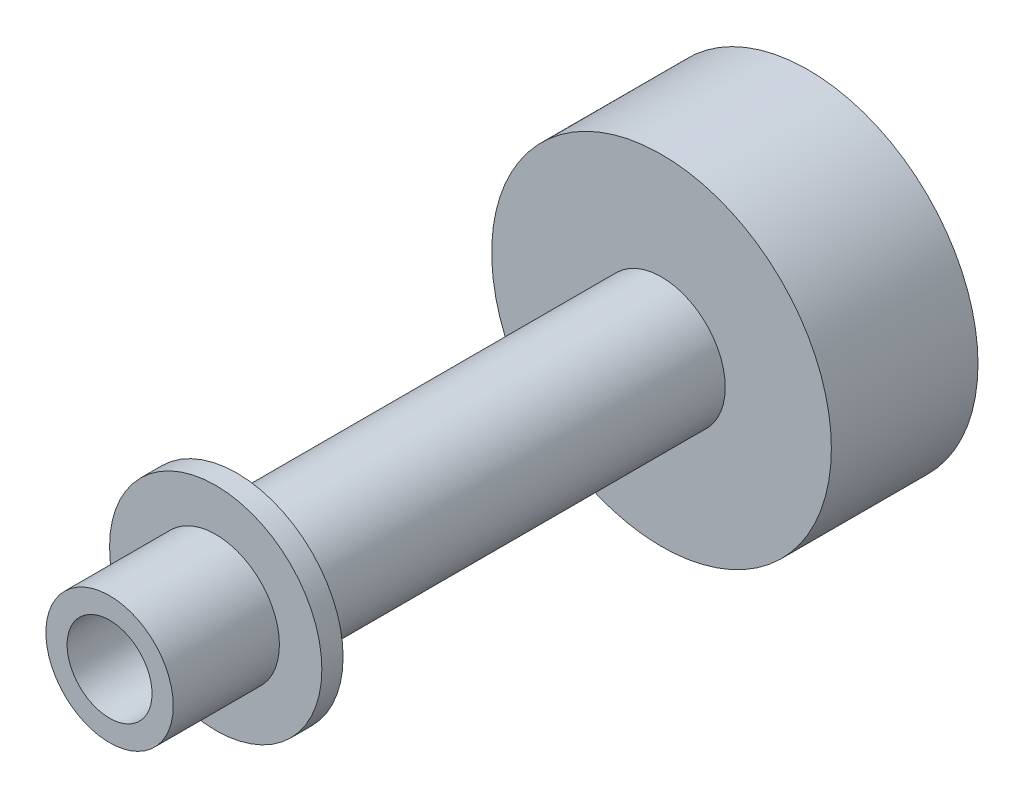
ISO-10303-21;
HEADER;
FILE_DESCRIPTION(('STEP AP214'),'2;1');
FILE_NAME('part.step','',(''),(''),'','','');
FILE_SCHEMA(('AUTOMOTIVE_DESIGN { 1 0 10303 214 1 1 1 1 }'));
ENDSEC;
DATA;
#1=APPLICATION_CONTEXT('core data for automotive mechanical design processes');
#2=APPLICATION_PROTOCOL_DEFINITION('international standard','automotive_design',2000,#1);
#3=PRODUCT_CONTEXT('',#1,'mechanical');
#4=PRODUCT('Part','Part','',(#3));
#5=PRODUCT_RELATED_PRODUCT_CATEGORY('part','',(#4));
#6=PRODUCT_DEFINITION_FORMATION('','',#4);
#7=PRODUCT_DEFINITION_CONTEXT('part definition',#1,'design');
#8=PRODUCT_DEFINITION('design','',#6,#7);
#9=PRODUCT_DEFINITION_SHAPE('','',#8);
#10=(LENGTH_UNIT() NAMED_UNIT(*) SI_UNIT(.MILLI.,.METRE.));
#11=(NAMED_UNIT(*) PLANE_ANGLE_UNIT() SI_UNIT($,.RADIAN.));
#12=(NAMED_UNIT(*) SI_UNIT($,.STERADIAN.) SOLID_ANGLE_UNIT());
#13=UNCERTAINTY_MEASURE_WITH_UNIT(LENGTH_MEASURE(1.E-05),#10,'distance_accuracy_value','');
#14=(GEOMETRIC_REPRESENTATION_CONTEXT(3) GLOBAL_UNCERTAINTY_ASSIGNED_CONTEXT((#13)) GLOBAL_UNIT_ASSIGNED_CONTEXT((#10,
#11,#12)) REPRESENTATION_CONTEXT('',''));
#15=CARTESIAN_POINT('',(0.,0.,0.));
#16=DIRECTION('',(0.,0.,1.));
#17=DIRECTION('',(1.,0.,0.));
#18=AXIS2_PLACEMENT_3D('',#15,#16,#17);
#19=CARTESIAN_POINT('',(0.,16.,-65.814));
#20=DIRECTION('',(0.,0.,-1.));
#21=DIRECTION('',(-1.,0.,0.));
#22=AXIS2_PLACEMENT_3D('',#19,#20,#21);
#23=PLANE('',#22);
#24=CARTESIAN_POINT('',(0.,0.,-65.814));
#25=DIRECTION('',(0.,0.,1.));
#26=DIRECTION('',(1.,0.,0.));
#27=AXIS2_PLACEMENT_3D('',#24,#25,#26);
#28=CIRCLE('',#27,4.00000000000001);
#29=CARTESIAN_POINT('',(4.00000000000001,0.,-65.814));
#30=VERTEX_POINT('',#29);
#31=EDGE_CURVE('E10',#30,#30,#28,.T.);
#32=ORIENTED_EDGE('',*,*,#31,.T.);
#33=EDGE_LOOP('',(#32));
#34=FACE_BOUND('',#33,.T.);
#35=CARTESIAN_POINT('',(0.,0.,-65.814));
#36=DIRECTION('',(0.,0.,1.));
#37=DIRECTION('',(1.,0.,0.));
#38=AXIS2_PLACEMENT_3D('',#35,#36,#37);
#39=CIRCLE('',#38,16.);
#40=CARTESIAN_POINT('',(16.,0.,-65.814));
#41=VERTEX_POINT('',#40);
#42=EDGE_CURVE('E73',#41,#41,#39,.T.);
#43=ORIENTED_EDGE('',*,*,#42,.F.);
#44=EDGE_LOOP('',(#43));
#45=FACE_BOUND('',#44,.T.);
#46=ADVANCED_FACE('F39',(#34,#45),#23,.T.);
#47=CARTESIAN_POINT('',(0.,0.,0.));
#48=DIRECTION('',(0.,0.,1.));
#49=DIRECTION('',(1.,0.,0.));
#50=AXIS2_PLACEMENT_3D('',#47,#48,#49);
#51=CYLINDRICAL_SURFACE('',#50,4.);
#52=CARTESIAN_POINT('',(0.,0.,0.));
#53=DIRECTION('',(0.,0.,1.));
#54=DIRECTION('',(1.,0.,0.));
#55=AXIS2_PLACEMENT_3D('',#52,#53,#54);
#56=CIRCLE('',#55,4.);
#57=CARTESIAN_POINT('',(4.,0.,0.));
#58=VERTEX_POINT('',#57);
#59=EDGE_CURVE('E45',#58,#58,#56,.T.);
#60=ORIENTED_EDGE('',*,*,#59,.T.);
#61=EDGE_LOOP('',(#60));
#62=FACE_BOUND('',#61,.T.);
#63=ORIENTED_EDGE('',*,*,#31,.F.);
#64=EDGE_LOOP('',(#63));
#65=FACE_BOUND('',#64,.T.);
#66=ADVANCED_FACE('F81',(#62,#65),#51,.F.);
#67=CARTESIAN_POINT('',(0.,4.,0.));
#68=DIRECTION('',(0.,0.,1.));
#69=DIRECTION('',(1.,0.,0.));
#70=AXIS2_PLACEMENT_3D('',#67,#68,#69);
#71=PLANE('',#70);
#72=CARTESIAN_POINT('',(0.,0.,0.));
#73=DIRECTION('',(0.,0.,1.));
#74=DIRECTION('',(1.,0.,0.));
#75=AXIS2_PLACEMENT_3D('',#72,#73,#74);
#76=CIRCLE('',#75,6.);
#77=CARTESIAN_POINT('',(6.,0.,0.));
#78=VERTEX_POINT('',#77);
#79=EDGE_CURVE('E49',#78,#78,#76,.T.);
#80=ORIENTED_EDGE('',*,*,#79,.T.);
#81=EDGE_LOOP('',(#80));
#82=FACE_BOUND('',#81,.T.);
#83=ORIENTED_EDGE('',*,*,#59,.F.);
#84=EDGE_LOOP('',(#83));
#85=FACE_BOUND('',#84,.T.);
#86=ADVANCED_FACE('F85',(#82,#85),#71,.T.);
#87=CARTESIAN_POINT('',(0.,0.,0.));
#88=DIRECTION('',(0.,0.,1.));
#89=DIRECTION('',(1.,0.,0.));
#90=AXIS2_PLACEMENT_3D('',#87,#88,#89);
#91=CYLINDRICAL_SURFACE('',#90,6.);
#92=CARTESIAN_POINT('',(0.,0.,-10.));
#93=DIRECTION('',(0.,0.,1.));
#94=DIRECTION('',(1.,0.,0.));
#95=AXIS2_PLACEMENT_3D('',#92,#93,#94);
#96=CIRCLE('',#95,6.);
#97=CARTESIAN_POINT('',(6.,0.,-10.));
#98=VERTEX_POINT('',#97);
#99=EDGE_CURVE('E53',#98,#98,#96,.T.);
#100=ORIENTED_EDGE('',*,*,#99,.T.);
#101=EDGE_LOOP('',(#100));
#102=FACE_BOUND('',#101,.T.);
#103=ORIENTED_EDGE('',*,*,#79,.F.);
#104=EDGE_LOOP('',(#103));
#105=FACE_BOUND('',#104,.T.);
#106=ADVANCED_FACE('F89',(#102,#105),#91,.T.);
#107=CARTESIAN_POINT('',(0.,6.,-10.));
#108=DIRECTION('',(0.,0.,1.));
#109=DIRECTION('',(1.,0.,0.));
#110=AXIS2_PLACEMENT_3D('',#107,#108,#109);
#111=PLANE('',#110);
#112=CARTESIAN_POINT('',(0.,0.,-10.));
#113=DIRECTION('',(0.,0.,1.));
#114=DIRECTION('',(1.,0.,0.));
#115=AXIS2_PLACEMENT_3D('',#112,#113,#114);
#116=CIRCLE('',#115,10.);
#117=CARTESIAN_POINT('',(10.,0.,-10.));
#118=VERTEX_POINT('',#117);
#119=EDGE_CURVE('E58',#118,#118,#116,.T.);
#120=ORIENTED_EDGE('',*,*,#119,.T.);
#121=EDGE_LOOP('',(#120));
#122=FACE_BOUND('',#121,.T.);
#123=ORIENTED_EDGE('',*,*,#99,.F.);
#124=EDGE_LOOP('',(#123));
#125=FACE_BOUND('',#124,.T.);
#126=ADVANCED_FACE('F96',(#122,#125),#111,.T.);
#127=CARTESIAN_POINT('',(0.,0.,0.));
#128=DIRECTION('',(0.,0.,1.));
#129=DIRECTION('',(1.,0.,0.));
#130=AXIS2_PLACEMENT_3D('',#127,#128,#129);
#131=CYLINDRICAL_SURFACE('',#130,10.);
#132=CARTESIAN_POINT('',(0.,0.,-12.));
#133=DIRECTION('',(0.,0.,1.));
#134=DIRECTION('',(1.,0.,0.));
#135=AXIS2_PLACEMENT_3D('',#132,#133,#134);
#136=CIRCLE('',#135,10.);
#137=CARTESIAN_POINT('',(10.,0.,-12.));
#138=VERTEX_POINT('',#137);
#139=EDGE_CURVE('E61',#138,#138,#136,.T.);
#140=ORIENTED_EDGE('',*,*,#139,.T.);
#141=EDGE_LOOP('',(#140));
#142=FACE_BOUND('',#141,.T.);
#143=ORIENTED_EDGE('',*,*,#119,.F.);
#144=EDGE_LOOP('',(#143));
#145=FACE_BOUND('',#144,.T.);
#146=ADVANCED_FACE('F100',(#142,#145),#131,.T.);
#147=CARTESIAN_POINT('',(0.,10.,-12.));
#148=DIRECTION('',(0.,0.,-1.));
#149=DIRECTION('',(-1.,0.,0.));
#150=AXIS2_PLACEMENT_3D('',#147,#148,#149);
#151=PLANE('',#150);
#152=CARTESIAN_POINT('',(0.,0.,-12.));
#153=DIRECTION('',(0.,0.,1.));
#154=DIRECTION('',(1.,0.,0.));
#155=AXIS2_PLACEMENT_3D('',#152,#153,#154);
#156=CIRCLE('',#155,6.);
#157=CARTESIAN_POINT('',(6.,0.,-12.));
#158=VERTEX_POINT('',#157);
#159=EDGE_CURVE('E64',#158,#158,#156,.T.);
#160=ORIENTED_EDGE('',*,*,#159,.T.);
#161=EDGE_LOOP('',(#160));
#162=FACE_BOUND('',#161,.T.);
#163=ORIENTED_EDGE('',*,*,#139,.F.);
#164=EDGE_LOOP('',(#163));
#165=FACE_BOUND('',#164,.T.);
#166=ADVANCED_FACE('F104',(#162,#165),#151,.T.);
#167=CARTESIAN_POINT('',(0.,0.,0.));
#168=DIRECTION('',(0.,0.,1.));
#169=DIRECTION('',(1.,0.,0.));
#170=AXIS2_PLACEMENT_3D('',#167,#168,#169);
#171=CYLINDRICAL_SURFACE('',#170,6.);
#172=CARTESIAN_POINT('',(0.,0.,-52.));
#173=DIRECTION('',(0.,0.,1.));
#174=DIRECTION('',(1.,0.,0.));
#175=AXIS2_PLACEMENT_3D('',#172,#173,#174);
#176=CIRCLE('',#175,6.);
#177=CARTESIAN_POINT('',(6.,0.,-52.));
#178=VERTEX_POINT('',#177);
#179=EDGE_CURVE('E67',#178,#178,#176,.T.);
#180=ORIENTED_EDGE('',*,*,#179,.T.);
#181=EDGE_LOOP('',(#180));
#182=FACE_BOUND('',#181,.T.);
#183=ORIENTED_EDGE('',*,*,#159,.F.);
#184=EDGE_LOOP('',(#183));
#185=FACE_BOUND('',#184,.T.);
#186=ADVANCED_FACE('F108',(#182,#185),#171,.T.);
#187=CARTESIAN_POINT('',(0.,6.,-52.));
#188=DIRECTION('',(0.,0.,1.));
#189=DIRECTION('',(1.,0.,0.));
#190=AXIS2_PLACEMENT_3D('',#187,#188,#189);
#191=PLANE('',#190);
#192=CARTESIAN_POINT('',(0.,0.,-52.));
#193=DIRECTION('',(0.,0.,1.));
#194=DIRECTION('',(1.,0.,0.));
#195=AXIS2_PLACEMENT_3D('',#192,#193,#194);
#196=CIRCLE('',#195,16.);
#197=CARTESIAN_POINT('',(16.,0.,-52.));
#198=VERTEX_POINT('',#197);
#199=EDGE_CURVE('E70',#198,#198,#196,.T.);
#200=ORIENTED_EDGE('',*,*,#199,.T.);
#201=EDGE_LOOP('',(#200));
#202=FACE_BOUND('',#201,.T.);
#203=ORIENTED_EDGE('',*,*,#179,.F.);
#204=EDGE_LOOP('',(#203));
#205=FACE_BOUND('',#204,.T.);
#206=ADVANCED_FACE('F112',(#202,#205),#191,.T.);
#207=CARTESIAN_POINT('',(0.,0.,0.));
#208=DIRECTION('',(0.,0.,1.));
#209=DIRECTION('',(1.,0.,0.));
#210=AXIS2_PLACEMENT_3D('',#207,#208,#209);
#211=CYLINDRICAL_SURFACE('',#210,16.);
#212=ORIENTED_EDGE('',*,*,#42,.T.);
#213=EDGE_LOOP('',(#212));
#214=FACE_BOUND('',#213,.T.);
#215=ORIENTED_EDGE('',*,*,#199,.F.);
#216=EDGE_LOOP('',(#215));
#217=FACE_BOUND('',#216,.T.);
#218=ADVANCED_FACE('F77',(#214,#217),#211,.T.);
#219=CLOSED_SHELL('',(#46,#66,#86,#106,#126,#146,#166,#186,#206,#218));
#220=MANIFOLD_SOLID_BREP('B2',#219);
#221=ADVANCED_BREP_SHAPE_REPRESENTATION('',(#18,#220),#14);
#222=SHAPE_DEFINITION_REPRESENTATION(#9,#221);
ENDSEC;
END-ISO-10303-21;
